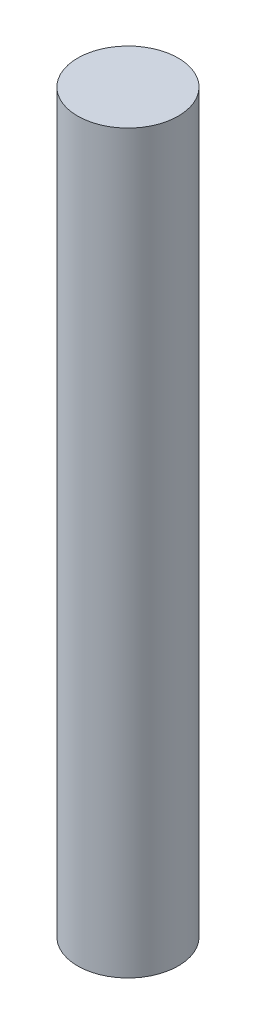
ISO-10303-21;
HEADER;
FILE_DESCRIPTION(('STEP AP214'),'2;1');
FILE_NAME('part.step','',(''),(''),'','','');
FILE_SCHEMA(('AUTOMOTIVE_DESIGN { 1 0 10303 214 1 1 1 1 }'));
ENDSEC;
DATA;
#1=APPLICATION_CONTEXT('core data for automotive mechanical design processes');
#2=APPLICATION_PROTOCOL_DEFINITION('international standard','automotive_design',2000,#1);
#3=PRODUCT_CONTEXT('',#1,'mechanical');
#4=PRODUCT('Part','Part','',(#3));
#5=PRODUCT_RELATED_PRODUCT_CATEGORY('part','',(#4));
#6=PRODUCT_DEFINITION_FORMATION('','',#4);
#7=PRODUCT_DEFINITION_CONTEXT('part definition',#1,'design');
#8=PRODUCT_DEFINITION('design','',#6,#7);
#9=PRODUCT_DEFINITION_SHAPE('','',#8);
#10=(LENGTH_UNIT() NAMED_UNIT(*) SI_UNIT(.MILLI.,.METRE.));
#11=(NAMED_UNIT(*) PLANE_ANGLE_UNIT() SI_UNIT($,.RADIAN.));
#12=(NAMED_UNIT(*) SI_UNIT($,.STERADIAN.) SOLID_ANGLE_UNIT());
#13=UNCERTAINTY_MEASURE_WITH_UNIT(LENGTH_MEASURE(1.E-05),#10,'distance_accuracy_value','');
#14=(GEOMETRIC_REPRESENTATION_CONTEXT(3) GLOBAL_UNCERTAINTY_ASSIGNED_CONTEXT((#13)) GLOBAL_UNIT_ASSIGNED_CONTEXT((#10,
#11,#12)) REPRESENTATION_CONTEXT('',''));
#15=CARTESIAN_POINT('',(0.,0.,0.));
#16=DIRECTION('',(0.,0.,1.));
#17=DIRECTION('',(1.,0.,0.));
#18=AXIS2_PLACEMENT_3D('',#15,#16,#17);
#19=CARTESIAN_POINT('',(0.,30.,0.));
#20=DIRECTION('',(0.,-1.,0.));
#21=DIRECTION('',(0.,0.,-1.));
#22=AXIS2_PLACEMENT_3D('',#19,#20,#21);
#23=CYLINDRICAL_SURFACE('',#22,2.05);
#24=CARTESIAN_POINT('',(0.,30.,0.));
#25=DIRECTION('',(0.,1.,0.));
#26=DIRECTION('',(0.,0.,1.));
#27=AXIS2_PLACEMENT_3D('',#24,#25,#26);
#28=CIRCLE('',#27,2.05);
#29=CARTESIAN_POINT('',(0.,30.,2.05));
#30=VERTEX_POINT('',#29);
#31=EDGE_CURVE('E10',#30,#30,#28,.T.);
#32=ORIENTED_EDGE('',*,*,#31,.F.);
#33=EDGE_LOOP('',(#32));
#34=FACE_BOUND('',#33,.T.);
#35=CARTESIAN_POINT('',(0.,0.,0.));
#36=DIRECTION('',(0.,1.,0.));
#37=DIRECTION('',(0.,0.,1.));
#38=AXIS2_PLACEMENT_3D('',#35,#36,#37);
#39=CIRCLE('',#38,2.05);
#40=CARTESIAN_POINT('',(0.,0.,2.05));
#41=VERTEX_POINT('',#40);
#42=EDGE_CURVE('E40',#41,#41,#39,.T.);
#43=ORIENTED_EDGE('',*,*,#42,.T.);
#44=EDGE_LOOP('',(#43));
#45=FACE_BOUND('',#44,.T.);
#46=ADVANCED_FACE('F37',(#34,#45),#23,.T.);
#47=CARTESIAN_POINT('',(0.,30.,0.));
#48=DIRECTION('',(0.,1.,0.));
#49=DIRECTION('',(0.,0.,1.));
#50=AXIS2_PLACEMENT_3D('',#47,#48,#49);
#51=PLANE('',#50);
#52=ORIENTED_EDGE('',*,*,#31,.T.);
#53=EDGE_LOOP('',(#52));
#54=FACE_BOUND('',#53,.T.);
#55=ADVANCED_FACE('F54',(#54),#51,.T.);
#56=CARTESIAN_POINT('',(0.,0.,0.));
#57=DIRECTION('',(0.,1.,0.));
#58=DIRECTION('',(0.,0.,1.));
#59=AXIS2_PLACEMENT_3D('',#56,#57,#58);
#60=PLANE('',#59);
#61=ORIENTED_EDGE('',*,*,#42,.F.);
#62=EDGE_LOOP('',(#61));
#63=FACE_BOUND('',#62,.T.);
#64=ADVANCED_FACE('F52',(#63),#60,.F.);
#65=CLOSED_SHELL('',(#46,#55,#64));
#66=MANIFOLD_SOLID_BREP('B2',#65);
#67=ADVANCED_BREP_SHAPE_REPRESENTATION('',(#18,#66),#14);
#68=SHAPE_DEFINITION_REPRESENTATION(#9,#67);
ENDSEC;
END-ISO-10303-21;
